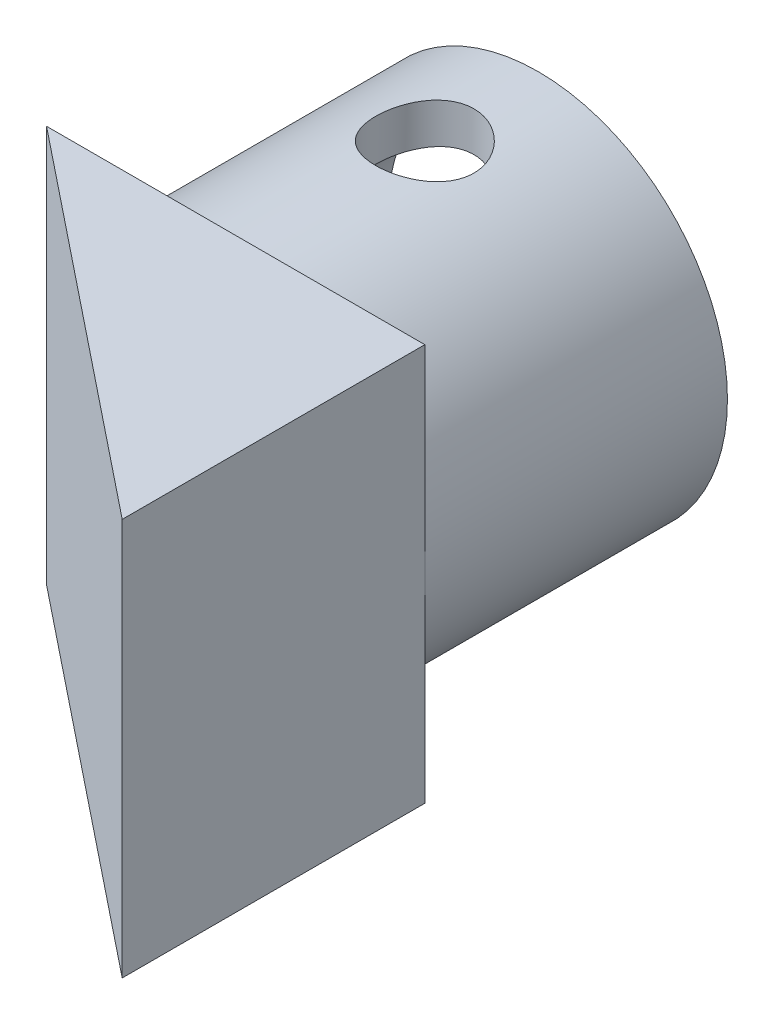
ISO-10303-21;
HEADER;
FILE_DESCRIPTION(('STEP AP214'),'2;1');
FILE_NAME('part.step','',(''),(''),'','','');
FILE_SCHEMA(('AUTOMOTIVE_DESIGN { 1 0 10303 214 1 1 1 1 }'));
ENDSEC;
DATA;
#1=APPLICATION_CONTEXT('core data for automotive mechanical design processes');
#2=APPLICATION_PROTOCOL_DEFINITION('international standard','automotive_design',2000,#1);
#3=PRODUCT_CONTEXT('',#1,'mechanical');
#4=PRODUCT('Part','Part','',(#3));
#5=PRODUCT_RELATED_PRODUCT_CATEGORY('part','',(#4));
#6=PRODUCT_DEFINITION_FORMATION('','',#4);
#7=PRODUCT_DEFINITION_CONTEXT('part definition',#1,'design');
#8=PRODUCT_DEFINITION('design','',#6,#7);
#9=PRODUCT_DEFINITION_SHAPE('','',#8);
#10=(LENGTH_UNIT() NAMED_UNIT(*) SI_UNIT(.MILLI.,.METRE.));
#11=(NAMED_UNIT(*) PLANE_ANGLE_UNIT() SI_UNIT($,.RADIAN.));
#12=(NAMED_UNIT(*) SI_UNIT($,.STERADIAN.) SOLID_ANGLE_UNIT());
#13=UNCERTAINTY_MEASURE_WITH_UNIT(LENGTH_MEASURE(1.E-05),#10,'distance_accuracy_value','');
#14=(GEOMETRIC_REPRESENTATION_CONTEXT(3) GLOBAL_UNCERTAINTY_ASSIGNED_CONTEXT((#13)) GLOBAL_UNIT_ASSIGNED_CONTEXT((#10,
#11,#12)) REPRESENTATION_CONTEXT('',''));
#15=CARTESIAN_POINT('',(0.,0.,0.));
#16=DIRECTION('',(0.,0.,1.));
#17=DIRECTION('',(1.,0.,0.));
#18=AXIS2_PLACEMENT_3D('',#15,#16,#17);
#19=CARTESIAN_POINT('',(0.,0.,0.));
#20=DIRECTION('',(0.,0.,1.));
#21=DIRECTION('',(1.,0.,0.));
#22=AXIS2_PLACEMENT_3D('',#19,#20,#21);
#23=PLANE('',#22);
#24=CARTESIAN_POINT('',(0.,0.,0.));
#25=DIRECTION('',(0.,0.,1.));
#26=DIRECTION('',(1.,0.,0.));
#27=AXIS2_PLACEMENT_3D('',#24,#25,#26);
#28=CIRCLE('',#27,5.);
#29=CARTESIAN_POINT('',(5.,0.,0.));
#30=VERTEX_POINT('',#29);
#31=EDGE_CURVE('E128',#30,#30,#28,.T.);
#32=ORIENTED_EDGE('',*,*,#31,.F.);
#33=EDGE_LOOP('',(#32));
#34=FACE_BOUND('',#33,.T.);
#35=CARTESIAN_POINT('',(0.,0.,0.));
#36=DIRECTION('',(0.,0.,1.));
#37=DIRECTION('',(1.,0.,0.));
#38=AXIS2_PLACEMENT_3D('',#35,#36,#37);
#39=CIRCLE('',#38,3.95);
#40=CARTESIAN_POINT('',(3.95,0.,0.));
#41=VERTEX_POINT('',#40);
#42=EDGE_CURVE('E126',#41,#41,#39,.T.);
#43=ORIENTED_EDGE('',*,*,#42,.T.);
#44=EDGE_LOOP('',(#43));
#45=FACE_BOUND('',#44,.T.);
#46=ADVANCED_FACE('F35',(#34,#45),#23,.F.);
#47=CARTESIAN_POINT('',(0.,0.,8.));
#48=DIRECTION('',(0.,0.,-1.));
#49=DIRECTION('',(-1.,0.,0.));
#50=AXIS2_PLACEMENT_3D('',#47,#48,#49);
#51=CYLINDRICAL_SURFACE('',#50,5.);
#52=CARTESIAN_POINT('',(0.,-5.,4.3));
#53=CARTESIAN_POINT('',(0.0717307786716108,-4.99999885912454,4.29999816586154));
#54=CARTESIAN_POINT('',(0.14348153894728,-4.998441140995,4.29404317706765));
#55=CARTESIAN_POINT('',(0.284920413497907,-4.99237823364744,4.2704200751648));
#56=CARTESIAN_POINT('',(0.354607444099347,-4.98787152361252,4.25274591833176));
#57=CARTESIAN_POINT('',(0.489856453463625,-4.97640871761101,4.20629469406177));
#58=CARTESIAN_POINT('',(0.555423483742325,-4.96945569296409,4.1775315444106));
#59=CARTESIAN_POINT('',(0.680802479922511,-4.95383737776702,4.10976934681149));
#60=CARTESIAN_POINT('',(0.740614138181474,-4.94517199576156,4.07076975210864));
#61=CARTESIAN_POINT('',(0.854108529262041,-4.92685216626646,3.98273009067953));
#62=CARTESIAN_POINT('',(0.907645708599976,-4.91718147538334,3.93350576070611));
#63=CARTESIAN_POINT('',(1.0058054182008,-4.89804673326225,3.82680807084766));
#64=CARTESIAN_POINT('',(1.05042685981889,-4.88858270738436,3.76933370507305));
#65=CARTESIAN_POINT('',(1.13018788316099,-4.87076767855598,3.64661851125556));
#66=CARTESIAN_POINT('',(1.16516190324781,-4.86243722215411,3.58126681773134));
#67=CARTESIAN_POINT('',(1.22356960439174,-4.84807058079245,3.44535959205325));
#68=CARTESIAN_POINT('',(1.24700529718818,-4.84203399593172,3.37480496951268));
#69=CARTESIAN_POINT('',(1.281169228899,-4.83310598130334,3.23210205052739));
#70=CARTESIAN_POINT('',(1.29216048290362,-4.83014956376373,3.16002088452016));
#71=CARTESIAN_POINT('',(1.3019432296733,-4.82752230668979,3.01498176997082));
#72=CARTESIAN_POINT('',(1.30073688084738,-4.82785088586354,2.94202397883275));
#73=CARTESIAN_POINT('',(1.2863678960504,-4.83169822957429,2.79934028716682));
#74=CARTESIAN_POINT('',(1.2735215273875,-4.83513260277125,2.72957990208878));
#75=CARTESIAN_POINT('',(1.23674288104121,-4.84466969943908,2.59324021046968));
#76=CARTESIAN_POINT('',(1.21280975642708,-4.85077262676204,2.52666114738238));
#77=CARTESIAN_POINT('',(1.15427447680391,-4.86503471141451,2.39774002853324));
#78=CARTESIAN_POINT('',(1.11955986166448,-4.87321536914182,2.33545151285766));
#79=CARTESIAN_POINT('',(1.04052555441476,-4.89069936804917,2.21747178012729));
#80=CARTESIAN_POINT('',(0.996204056417375,-4.90000292016326,2.16178180650457));
#81=CARTESIAN_POINT('',(0.897588399354158,-4.9190373655284,2.0567707801978));
#82=CARTESIAN_POINT('',(0.843028117151478,-4.92877257463288,2.00770008928812));
#83=CARTESIAN_POINT('',(0.726334791666221,-4.947314710364,1.91935513083208));
#84=CARTESIAN_POINT('',(0.664201478488647,-4.95612160388557,1.88008121258463));
#85=CARTESIAN_POINT('',(0.533750553018985,-4.97186464472852,1.81234191921762));
#86=CARTESIAN_POINT('',(0.465409427094992,-4.97879324641701,1.78391995820683));
#87=CARTESIAN_POINT('',(0.324698261892371,-4.98994437896931,1.73903950096387));
#88=CARTESIAN_POINT('',(0.25232906151994,-4.99416747102063,1.72257852364206));
#89=CARTESIAN_POINT('',(0.107754265628856,-4.99934762845146,1.70247601810568));
#90=CARTESIAN_POINT('',(0.0355990679618569,-5.00039144909205,1.69849388039378));
#91=CARTESIAN_POINT('',(-0.108347558385988,-4.9993439302767,1.70252407708697));
#92=CARTESIAN_POINT('',(-0.180139021986154,-4.99725289772412,1.71053523734338));
#93=CARTESIAN_POINT('',(-0.320117661841459,-4.9902264842307,1.73804465756627));
#94=CARTESIAN_POINT('',(-0.3883443967086,-4.98533775354441,1.75735463113079));
#95=CARTESIAN_POINT('',(-0.520584855265785,-4.97326895706077,1.80669635149957));
#96=CARTESIAN_POINT('',(-0.584598133561371,-4.966088649494,1.83672922964772));
#97=CARTESIAN_POINT('',(-0.707930992016775,-4.95002802767655,1.90730750951055));
#98=CARTESIAN_POINT('',(-0.767139321552233,-4.94111821378144,1.94804043928579));
#99=CARTESIAN_POINT('',(-0.878000441471827,-4.92262930746647,2.03862522166252));
#100=CARTESIAN_POINT('',(-0.929651812778711,-4.91305008984093,2.08847878302904));
#101=CARTESIAN_POINT('',(-1.02535533145664,-4.89398559724572,2.19747610283433));
#102=CARTESIAN_POINT('',(-1.0691676974822,-4.88450966299983,2.25683240802754));
#103=CARTESIAN_POINT('',(-1.14621298401497,-4.86700757475785,2.38225303325104));
#104=CARTESIAN_POINT('',(-1.1794463607291,-4.85898135825078,2.44831706385618));
#105=CARTESIAN_POINT('',(-1.23414034237999,-4.84537844502717,2.58493610486184));
#106=CARTESIAN_POINT('',(-1.25567007103908,-4.83978740561989,2.65546193804776));
#107=CARTESIAN_POINT('',(-1.28651743722663,-4.83168004742566,2.79930171484937));
#108=CARTESIAN_POINT('',(-1.29583800946139,-4.82916298975776,2.87261498408958));
#109=CARTESIAN_POINT('',(-1.30183988013393,-4.82754813134566,3.01749983369733));
#110=CARTESIAN_POINT('',(-1.29890566929442,-4.82834631145179,3.08905457201614));
#111=CARTESIAN_POINT('',(-1.28136829919157,-4.83302969132189,3.2306112653395));
#112=CARTESIAN_POINT('',(-1.26676541261453,-4.83691481894669,3.30061325659105));
#113=CARTESIAN_POINT('',(-1.22652296626336,-4.84727400349191,3.43662027692297));
#114=CARTESIAN_POINT('',(-1.20096107281371,-4.85372981947422,3.5026497724797));
#115=CARTESIAN_POINT('',(-1.13958690119683,-4.86850424398437,3.62953183040472));
#116=CARTESIAN_POINT('',(-1.10377308914157,-4.87682313122364,3.6903836163174));
#117=CARTESIAN_POINT('',(-1.02173013022611,-4.89467814244603,3.8070274672692));
#118=CARTESIAN_POINT('',(-0.975236798928221,-4.90424188358561,3.86262951434169));
#119=CARTESIAN_POINT('',(-0.87366206477925,-4.92335054739323,3.96536747478793));
#120=CARTESIAN_POINT('',(-0.818578597936101,-4.93289546497886,4.01250134760105));
#121=CARTESIAN_POINT('',(-0.700055598942872,-4.95111947868785,4.09789014611913));
#122=CARTESIAN_POINT('',(-0.636470787048337,-4.9597774014975,4.13594830359197));
#123=CARTESIAN_POINT('',(-0.503584101499031,-4.97502379799897,4.20077479935966));
#124=CARTESIAN_POINT('',(-0.434286110017087,-4.9816136625622,4.22755072968078));
#125=CARTESIAN_POINT('',(-0.304324490623244,-4.99107925028337,4.26536273677146));
#126=CARTESIAN_POINT('',(-0.244245830872915,-4.99440072931575,4.27832240703174));
#127=CARTESIAN_POINT('',(-0.122782916586036,-4.99886149574191,4.29564144249486));
#128=CARTESIAN_POINT('',(-0.0613987782532483,-5.00000097654537,4.30000156995174));
#129=CARTESIAN_POINT('',(0.,-5.,4.3));
#130=B_SPLINE_CURVE_WITH_KNOTS('',3,(#52,#53,#54,#55,#56,#57,#58,#59,#60,#61,#62,#63,#64,#65,
#66,#67,#68,#69,#70,#71,#72,#73,#74,#75,#76,#77,#78,#79,#80,#81,#82,#83,#84,#85,#86,#87,#88,#89,
#90,#91,#92,#93,#94,#95,#96,#97,#98,#99,#100,#101,#102,#103,#104,#105,#106,#107,#108,#109,#110,
#111,#112,#113,#114,#115,#116,#117,#118,#119,#120,#121,#122,#123,#124,#125,#126,#127,#128,#129),
.UNSPECIFIED.,.T.,.F.,(4,2,2,2,2,2,2,2,2,2,2,2,2,2,2,2,2,2,2,2,2,2,2,2,2,2,2,2,2,2,2,2,2,2,2,2,
2,2,4),(0.,0.214967237033415,0.43004542172036,0.64485453617895,0.859675126481417,
1.07876816860036,1.29788794646979,1.52056237814132,1.74319797214783,1.96103475933145,
2.17883300019886,2.39088534386669,2.60295388914234,2.8173133212086,3.03171308323144,
3.25274629224052,3.47378738094936,3.69570372080879,3.91757401498792,4.13333313105578,
4.34907112560078,4.56131245775761,4.77357618952829,4.98984196043499,5.20614829065226,
5.42823125959202,5.65030465015768,5.87105177957784,6.09174583842406,6.30556854774109,
6.51938626036272,6.73171306829717,6.94407166110446,7.16239228611878,7.38076544910422,
7.60351288552391,7.82611019062644,8.01013016140658,8.19413382012542),.UNSPECIFIED.);
#131=CARTESIAN_POINT('',(0.,-5.,4.3));
#132=VERTEX_POINT('',#131);
#133=EDGE_CURVE('E100',#132,#132,#130,.T.);
#134=ORIENTED_EDGE('',*,*,#133,.T.);
#135=EDGE_LOOP('',(#134));
#136=FACE_BOUND('',#135,.T.);
#137=CARTESIAN_POINT('',(0.,5.,4.3));
#138=CARTESIAN_POINT('',(-0.0717307786716102,4.99999885912454,4.29999816586154));
#139=CARTESIAN_POINT('',(-0.14348153894728,4.998441140995,4.29404317706765));
#140=CARTESIAN_POINT('',(-0.284920413497906,4.99237823364744,4.2704200751648));
#141=CARTESIAN_POINT('',(-0.354607444099346,4.98787152361252,4.25274591833176));
#142=CARTESIAN_POINT('',(-0.489856453463625,4.97640871761101,4.20629469406177));
#143=CARTESIAN_POINT('',(-0.555423483742324,4.96945569296409,4.1775315444106));
#144=CARTESIAN_POINT('',(-0.68080247992251,4.95383737776702,4.10976934681149));
#145=CARTESIAN_POINT('',(-0.740614138181473,4.94517199576156,4.07076975210864));
#146=CARTESIAN_POINT('',(-0.854108529262041,4.92685216626646,3.98273009067953));
#147=CARTESIAN_POINT('',(-0.907645708599976,4.91718147538334,3.93350576070611));
#148=CARTESIAN_POINT('',(-1.0058054182008,4.89804673326225,3.82680807084766));
#149=CARTESIAN_POINT('',(-1.05042685981889,4.88858270738436,3.76933370507305));
#150=CARTESIAN_POINT('',(-1.13018788316099,4.87076767855598,3.64661851125556));
#151=CARTESIAN_POINT('',(-1.16516190324781,4.86243722215411,3.58126681773134));
#152=CARTESIAN_POINT('',(-1.22356960439173,4.84807058079245,3.44535959205325));
#153=CARTESIAN_POINT('',(-1.24700529718818,4.84203399593172,3.37480496951268));
#154=CARTESIAN_POINT('',(-1.281169228899,4.83310598130334,3.23210205052739));
#155=CARTESIAN_POINT('',(-1.29216048290362,4.83014956376373,3.16002088452016));
#156=CARTESIAN_POINT('',(-1.3019432296733,4.82752230668979,3.01498176997082));
#157=CARTESIAN_POINT('',(-1.30073688084738,4.82785088586354,2.94202397883275));
#158=CARTESIAN_POINT('',(-1.2863678960504,4.83169822957429,2.79934028716682));
#159=CARTESIAN_POINT('',(-1.2735215273875,4.83513260277125,2.72957990208878));
#160=CARTESIAN_POINT('',(-1.23674288104121,4.84466969943908,2.59324021046968));
#161=CARTESIAN_POINT('',(-1.21280975642707,4.85077262676204,2.52666114738238));
#162=CARTESIAN_POINT('',(-1.15427447680391,4.86503471141451,2.39774002853324));
#163=CARTESIAN_POINT('',(-1.11955986166448,4.87321536914182,2.33545151285766));
#164=CARTESIAN_POINT('',(-1.04052555441476,4.89069936804917,2.21747178012729));
#165=CARTESIAN_POINT('',(-0.996204056417375,4.90000292016326,2.16178180650458));
#166=CARTESIAN_POINT('',(-0.897588399354157,4.9190373655284,2.0567707801978));
#167=CARTESIAN_POINT('',(-0.843028117151478,4.92877257463288,2.00770008928812));
#168=CARTESIAN_POINT('',(-0.726334791666221,4.947314710364,1.91935513083208));
#169=CARTESIAN_POINT('',(-0.664201478488647,4.95612160388557,1.88008121258463));
#170=CARTESIAN_POINT('',(-0.533750553018985,4.97186464472852,1.81234191921762));
#171=CARTESIAN_POINT('',(-0.465409427094992,4.978793246417,1.78391995820683));
#172=CARTESIAN_POINT('',(-0.324698261892371,4.98994437896931,1.73903950096387));
#173=CARTESIAN_POINT('',(-0.25232906151994,4.99416747102063,1.72257852364206));
#174=CARTESIAN_POINT('',(-0.107754265628856,4.99934762845146,1.70247601810568));
#175=CARTESIAN_POINT('',(-0.0355990679618568,5.00039144909205,1.69849388039378));
#176=CARTESIAN_POINT('',(0.108347558385988,4.9993439302767,1.70252407708697));
#177=CARTESIAN_POINT('',(0.180139021986154,4.99725289772412,1.71053523734338));
#178=CARTESIAN_POINT('',(0.320117661841459,4.9902264842307,1.73804465756627));
#179=CARTESIAN_POINT('',(0.3883443967086,4.98533775354441,1.75735463113079));
#180=CARTESIAN_POINT('',(0.520584855265785,4.97326895706077,1.80669635149957));
#181=CARTESIAN_POINT('',(0.584598133561372,4.966088649494,1.83672922964772));
#182=CARTESIAN_POINT('',(0.707930992016775,4.95002802767655,1.90730750951055));
#183=CARTESIAN_POINT('',(0.767139321552233,4.94111821378144,1.94804043928579));
#184=CARTESIAN_POINT('',(0.878000441471828,4.92262930746647,2.03862522166252));
#185=CARTESIAN_POINT('',(0.929651812778711,4.91305008984093,2.08847878302904));
#186=CARTESIAN_POINT('',(1.02535533145664,4.89398559724572,2.19747610283433));
#187=CARTESIAN_POINT('',(1.0691676974822,4.88450966299983,2.25683240802754));
#188=CARTESIAN_POINT('',(1.14621298401497,4.86700757475785,2.38225303325104));
#189=CARTESIAN_POINT('',(1.1794463607291,4.85898135825078,2.44831706385618));
#190=CARTESIAN_POINT('',(1.23414034237999,4.84537844502717,2.58493610486184));
#191=CARTESIAN_POINT('',(1.25567007103908,4.83978740561989,2.65546193804776));
#192=CARTESIAN_POINT('',(1.28651743722663,4.83168004742566,2.79930171484937));
#193=CARTESIAN_POINT('',(1.29583800946139,4.82916298975776,2.87261498408958));
#194=CARTESIAN_POINT('',(1.30183988013393,4.82754813134566,3.01749983369733));
#195=CARTESIAN_POINT('',(1.29890566929442,4.82834631145179,3.08905457201614));
#196=CARTESIAN_POINT('',(1.28136829919157,4.83302969132189,3.2306112653395));
#197=CARTESIAN_POINT('',(1.26676541261453,4.83691481894669,3.30061325659104));
#198=CARTESIAN_POINT('',(1.22652296626336,4.84727400349191,3.43662027692297));
#199=CARTESIAN_POINT('',(1.20096107281371,4.85372981947422,3.5026497724797));
#200=CARTESIAN_POINT('',(1.13958690119683,4.86850424398437,3.62953183040472));
#201=CARTESIAN_POINT('',(1.10377308914157,4.87682313122364,3.6903836163174));
#202=CARTESIAN_POINT('',(1.02173013022611,4.89467814244602,3.8070274672692));
#203=CARTESIAN_POINT('',(0.975236798928222,4.90424188358561,3.86262951434169));
#204=CARTESIAN_POINT('',(0.873662064779251,4.92335054739323,3.96536747478793));
#205=CARTESIAN_POINT('',(0.818578597936103,4.93289546497886,4.01250134760105));
#206=CARTESIAN_POINT('',(0.700055598942874,4.95111947868785,4.09789014611913));
#207=CARTESIAN_POINT('',(0.636470787048339,4.9597774014975,4.13594830359197));
#208=CARTESIAN_POINT('',(0.503584101499032,4.97502379799897,4.20077479935966));
#209=CARTESIAN_POINT('',(0.434286110017088,4.9816136625622,4.22755072968078));
#210=CARTESIAN_POINT('',(0.304324490623245,4.99107925028337,4.26536273677146));
#211=CARTESIAN_POINT('',(0.244245830872916,4.99440072931575,4.27832240703174));
#212=CARTESIAN_POINT('',(0.122782916586037,4.99886149574191,4.29564144249486));
#213=CARTESIAN_POINT('',(0.061398778253249,5.00000097654536,4.30000156995174));
#214=CARTESIAN_POINT('',(0.,5.,4.3));
#215=B_SPLINE_CURVE_WITH_KNOTS('',3,(#137,#138,#139,#140,#141,#142,#143,#144,#145,#146,#147,
#148,#149,#150,#151,#152,#153,#154,#155,#156,#157,#158,#159,#160,#161,#162,#163,#164,#165,#166,
#167,#168,#169,#170,#171,#172,#173,#174,#175,#176,#177,#178,#179,#180,#181,#182,#183,#184,#185,
#186,#187,#188,#189,#190,#191,#192,#193,#194,#195,#196,#197,#198,#199,#200,#201,#202,#203,#204,
#205,#206,#207,#208,#209,#210,#211,#212,#213,#214),.UNSPECIFIED.,.T.,.F.,(4,2,2,2,2,2,2,2,2,2,2,
2,2,2,2,2,2,2,2,2,2,2,2,2,2,2,2,2,2,2,2,2,2,2,2,2,2,2,4),(0.,0.214967237033415,0.43004542172036,
0.64485453617895,0.859675126481417,1.07876816860036,1.29788794646979,1.52056237814133,
1.74319797214784,1.96103475933145,2.17883300019886,2.39088534386669,2.60295388914234,
2.8173133212086,3.03171308323144,3.25274629224052,3.47378738094936,3.69570372080879,
3.91757401498792,4.13333313105578,4.34907112560077,4.56131245775761,4.77357618952829,
4.98984196043498,5.20614829065226,5.42823125959202,5.65030465015768,5.87105177957784,
6.09174583842406,6.30556854774109,6.51938626036272,6.73171306829716,6.94407166110446,
7.16239228611877,7.38076544910421,7.60351288552391,7.82611019062644,8.01013016140658,
8.19413382012542),.UNSPECIFIED.);
#216=CARTESIAN_POINT('',(0.,5.,4.3));
#217=VERTEX_POINT('',#216);
#218=EDGE_CURVE('E103',#217,#217,#215,.T.);
#219=ORIENTED_EDGE('',*,*,#218,.T.);
#220=EDGE_LOOP('',(#219));
#221=FACE_BOUND('',#220,.T.);
#222=CARTESIAN_POINT('',(0.,0.,8.));
#223=DIRECTION('',(0.,0.,1.));
#224=DIRECTION('',(1.,0.,0.));
#225=AXIS2_PLACEMENT_3D('',#222,#223,#224);
#226=CIRCLE('',#225,5.);
#227=CARTESIAN_POINT('',(5.,0.,8.));
#228=VERTEX_POINT('',#227);
#229=CARTESIAN_POINT('',(-5.,0.,8.));
#230=VERTEX_POINT('',#229);
#231=EDGE_CURVE('E11',#228,#230,#226,.T.);
#232=ORIENTED_EDGE('',*,*,#231,.F.);
#233=EDGE_CURVE('E50',#230,#228,#226,.T.);
#234=ORIENTED_EDGE('',*,*,#233,.F.);
#235=EDGE_LOOP('',(#232,#234));
#236=FACE_BOUND('',#235,.T.);
#237=ORIENTED_EDGE('',*,*,#31,.T.);
#238=EDGE_LOOP('',(#237));
#239=FACE_BOUND('',#238,.T.);
#240=ADVANCED_FACE('F37',(#136,#221,#236,#239),#51,.T.);
#241=CARTESIAN_POINT('',(0.,0.,8.));
#242=DIRECTION('',(0.,0.,-1.));
#243=DIRECTION('',(-1.,0.,0.));
#244=AXIS2_PLACEMENT_3D('',#241,#242,#243);
#245=CYLINDRICAL_SURFACE('',#244,3.95);
#246=CARTESIAN_POINT('',(0.,-3.95,4.3));
#247=CARTESIAN_POINT('',(0.0709829610794788,-3.95000007319669,4.30000015496706));
#248=CARTESIAN_POINT('',(0.14196536135004,-3.94806888480818,4.29416728741721));
#249=CARTESIAN_POINT('',(0.281842460307813,-3.94055500859883,4.27105919979852));
#250=CARTESIAN_POINT('',(0.350736888829278,-3.93497185033702,4.2537825055504));
#251=CARTESIAN_POINT('',(0.484401191575012,-3.92076136710928,4.20844096000981));
#252=CARTESIAN_POINT('',(0.549177652461634,-3.9121390556356,4.18039386915953));
#253=CARTESIAN_POINT('',(0.673107429858449,-3.89273244747134,4.11438698716866));
#254=CARTESIAN_POINT('',(0.732259678531228,-3.88194774142271,4.0764253187093));
#255=CARTESIAN_POINT('',(0.845265075149385,-3.85894489751455,3.99031612890366));
#256=CARTESIAN_POINT('',(0.89890136997805,-3.84669305468934,3.94189307254206));
#257=CARTESIAN_POINT('',(0.997456700192528,-3.82232422733423,3.83682165173222));
#258=CARTESIAN_POINT('',(1.04237387990989,-3.81020727202824,3.78017154081459));
#259=CARTESIAN_POINT('',(1.1234408644698,-3.78711121004201,3.65831739712311));
#260=CARTESIAN_POINT('',(1.15931106042597,-3.77617328695265,3.59291879013108));
#261=CARTESIAN_POINT('',(1.21945167342663,-3.75718505179296,3.45659912705684));
#262=CARTESIAN_POINT('',(1.24372552881538,-3.74913388396926,3.38567971516913));
#263=CARTESIAN_POINT('',(1.27917503844399,-3.73718516362997,3.24279371838596));
#264=CARTESIAN_POINT('',(1.29075620504918,-3.73315940217963,3.17093877498848));
#265=CARTESIAN_POINT('',(1.30175911632934,-3.72933778753418,3.02620155686063));
#266=CARTESIAN_POINT('',(1.30118450700256,-3.72954066600234,2.95331959672737));
#267=CARTESIAN_POINT('',(1.2882075087873,-3.73404088461962,2.81203373626257));
#268=CARTESIAN_POINT('',(1.2763314294693,-3.7381560226238,2.74357469058409));
#269=CARTESIAN_POINT('',(1.24194610977985,-3.7497193934349,2.60968097377534));
#270=CARTESIAN_POINT('',(1.21943562623389,-3.75716801592475,2.54424665722159));
#271=CARTESIAN_POINT('',(1.16407040176717,-3.77469092256335,2.4170521138585));
#272=CARTESIAN_POINT('',(1.13105780106689,-3.78480484262511,2.35536629655166));
#273=CARTESIAN_POINT('',(1.05573504075254,-3.80650183445498,2.23824219729294));
#274=CARTESIAN_POINT('',(1.0134222502111,-3.81808532155556,2.18280568993326));
#275=CARTESIAN_POINT('',(0.918161106732507,-3.84213602985152,2.07679261318661));
#276=CARTESIAN_POINT('',(0.864781593451721,-3.85461824878812,2.02660610268542));
#277=CARTESIAN_POINT('',(0.750209988414886,-3.87854424723023,1.93579673630937));
#278=CARTESIAN_POINT('',(0.689017185410521,-3.88998793203492,1.89517475205752));
#279=CARTESIAN_POINT('',(0.559744462015838,-3.91069118030887,1.82434398654903));
#280=CARTESIAN_POINT('',(0.49160487665367,-3.91992906245069,1.79423732821378));
#281=CARTESIAN_POINT('',(0.350851932060614,-3.9350226581483,1.74603371751428));
#282=CARTESIAN_POINT('',(0.278240095231164,-3.94087951567502,1.72793270272698));
#283=CARTESIAN_POINT('',(0.133907777181065,-3.94836276643493,1.70493970975314));
#284=CARTESIAN_POINT('',(0.0622799280435584,-3.95015792191676,1.69952046048883));
#285=CARTESIAN_POINT('',(-0.080874434703633,-3.94982019483739,1.70054603172145));
#286=CARTESIAN_POINT('',(-0.152400963007653,-3.94768795651755,1.7069889063806));
#287=CARTESIAN_POINT('',(-0.291227855065199,-3.93984632587967,1.73113729714739));
#288=CARTESIAN_POINT('',(-0.358590496320938,-3.93423914132638,1.74852122648915));
#289=CARTESIAN_POINT('',(-0.489417776330051,-3.92011519057551,1.79365820032025));
#290=CARTESIAN_POINT('',(-0.552881919398139,-3.91159805528393,1.82141256022208));
#291=CARTESIAN_POINT('',(-0.675944292882697,-3.89224643648506,1.88730191155046));
#292=CARTESIAN_POINT('',(-0.735399599198763,-3.88135758816091,1.92568742409159));
#293=CARTESIAN_POINT('',(-0.847197627537397,-3.85849938864648,2.01145387506343));
#294=CARTESIAN_POINT('',(-0.899538218222748,-3.84652971545561,2.05883749889035));
#295=CARTESIAN_POINT('',(-0.998029128419559,-3.82218877391626,2.16373522222728));
#296=CARTESIAN_POINT('',(-1.04380324807566,-3.80982315984666,2.22160470226723));
#297=CARTESIAN_POINT('',(-1.12503463563222,-3.78663273975186,2.34446983447141));
#298=CARTESIAN_POINT('',(-1.16049187612873,-3.77580793781943,2.40946550556379));
#299=CARTESIAN_POINT('',(-1.21990529933038,-3.75703410640062,2.54472890444885));
#300=CARTESIAN_POINT('',(-1.24388973000913,-3.74907802567282,2.61498318573575));
#301=CARTESIAN_POINT('',(-1.27958419134187,-3.73704776555513,2.7588543970303));
#302=CARTESIAN_POINT('',(-1.29129956872311,-3.73297189527993,2.83246984766635));
#303=CARTESIAN_POINT('',(-1.3017129830352,-3.72935255258117,2.97700571424406));
#304=CARTESIAN_POINT('',(-1.30103388967695,-3.72959220035743,3.04787633373853));
#305=CARTESIAN_POINT('',(-1.28820451606761,-3.73404260303012,3.18843802953583));
#306=CARTESIAN_POINT('',(-1.27605488625723,-3.73825313275631,3.25812917249318));
#307=CARTESIAN_POINT('',(-1.24106544064758,-3.75001139104323,3.3931056292899));
#308=CARTESIAN_POINT('',(-1.21842244972763,-3.7574975400071,3.45844774727636));
#309=CARTESIAN_POINT('',(-1.16324748256122,-3.77494219323695,3.58445605209423));
#310=CARTESIAN_POINT('',(-1.13071334686503,-3.78490123730203,3.64512121421631));
#311=CARTESIAN_POINT('',(-1.05505697496557,-3.80670007161102,3.76286197608261));
#312=CARTESIAN_POINT('',(-1.01154177410332,-3.81860203416956,3.81967349820157));
#313=CARTESIAN_POINT('',(-0.915828422105698,-3.84268011210813,3.92538928804488));
#314=CARTESIAN_POINT('',(-0.863627844240041,-3.85485630328434,3.97429133827809));
#315=CARTESIAN_POINT('',(-0.749665815985926,-3.87866086303045,4.06465216852757));
#316=CARTESIAN_POINT('',(-0.687618514208386,-3.89025137725221,4.10576162665907));
#317=CARTESIAN_POINT('',(-0.55711633930698,-3.91107127668562,4.1769199425958));
#318=CARTESIAN_POINT('',(-0.488663298715251,-3.92030133436528,4.20697195161911));
#319=CARTESIAN_POINT('',(-0.351026862609448,-3.93494752746252,4.25370601462609));
#320=CARTESIAN_POINT('',(-0.282074158010249,-3.94053976608284,4.27101187422552));
#321=CARTESIAN_POINT('',(-0.142080417052831,-3.94806549083472,4.29415730108766));
#322=CARTESIAN_POINT('',(-0.071039927671705,-3.94999992674457,4.29999984490858));
#323=CARTESIAN_POINT('',(0.,-3.95,4.3));
#324=B_SPLINE_CURVE_WITH_KNOTS('',3,(#246,#247,#248,#249,#250,#251,#252,#253,#254,#255,#256,
#257,#258,#259,#260,#261,#262,#263,#264,#265,#266,#267,#268,#269,#270,#271,#272,#273,#274,#275,
#276,#277,#278,#279,#280,#281,#282,#283,#284,#285,#286,#287,#288,#289,#290,#291,#292,#293,#294,
#295,#296,#297,#298,#299,#300,#301,#302,#303,#304,#305,#306,#307,#308,#309,#310,#311,#312,#313,
#314,#315,#316,#317,#318,#319,#320,#321,#322,#323),.UNSPECIFIED.,.T.,.F.,(4,2,2,2,2,2,2,2,2,2,2,
2,2,2,2,2,2,2,2,2,2,2,2,2,2,2,2,2,2,2,2,2,2,2,2,2,2,2,4),(0.,0.21268752357525,0.425402450617592,
0.637768105486071,0.850174000841619,1.06906314379544,1.28799882144892,1.51304348702423,
1.73802138481084,1.95558076606883,2.17307489358419,2.3809118534688,2.58877311575606,
2.79991944977384,3.01112559195614,3.23306326797123,3.45502116152521,3.67907835383957,
3.90305969181944,4.11754903269423,4.33200319232519,4.54043083618269,4.74888492652624,
4.9627445204427,5.1766680392046,5.40005360546788,5.62343976508835,5.84627304291175,
6.06900917182374,6.28058421457521,6.49214726061179,6.69989333042927,6.90768478829359,
7.12435351639361,7.34108288460678,7.56596749637109,7.79078796944134,8.0037014753647,
8.21655968896532),.UNSPECIFIED.);
#325=CARTESIAN_POINT('',(0.,-3.95,4.3));
#326=VERTEX_POINT('',#325);
#327=EDGE_CURVE('E40',#326,#326,#324,.T.);
#328=ORIENTED_EDGE('',*,*,#327,.F.);
#329=EDGE_LOOP('',(#328));
#330=FACE_BOUND('',#329,.T.);
#331=CARTESIAN_POINT('',(0.,3.95,4.3));
#332=CARTESIAN_POINT('',(-0.0709829610794781,3.95000007319669,4.30000015496706));
#333=CARTESIAN_POINT('',(-0.141965361350039,3.94806888480818,4.29416728741721));
#334=CARTESIAN_POINT('',(-0.281842460307813,3.94055500859883,4.27105919979852));
#335=CARTESIAN_POINT('',(-0.350736888829277,3.93497185033702,4.2537825055504));
#336=CARTESIAN_POINT('',(-0.484401191575012,3.92076136710928,4.20844096000981));
#337=CARTESIAN_POINT('',(-0.549177652461634,3.9121390556356,4.18039386915953));
#338=CARTESIAN_POINT('',(-0.673107429858449,3.89273244747134,4.11438698716866));
#339=CARTESIAN_POINT('',(-0.732259678531228,3.88194774142271,4.0764253187093));
#340=CARTESIAN_POINT('',(-0.845265075149385,3.85894489751455,3.99031612890366));
#341=CARTESIAN_POINT('',(-0.898901369978049,3.84669305468934,3.94189307254206));
#342=CARTESIAN_POINT('',(-0.997456700192528,3.82232422733423,3.83682165173222));
#343=CARTESIAN_POINT('',(-1.04237387990989,3.81020727202824,3.78017154081459));
#344=CARTESIAN_POINT('',(-1.1234408644698,3.78711121004201,3.65831739712311));
#345=CARTESIAN_POINT('',(-1.15931106042597,3.77617328695265,3.59291879013108));
#346=CARTESIAN_POINT('',(-1.21945167342663,3.75718505179296,3.45659912705684));
#347=CARTESIAN_POINT('',(-1.24372552881538,3.74913388396926,3.38567971516913));
#348=CARTESIAN_POINT('',(-1.27917503844399,3.73718516362997,3.24279371838596));
#349=CARTESIAN_POINT('',(-1.29075620504918,3.73315940217963,3.17093877498848));
#350=CARTESIAN_POINT('',(-1.30175911632934,3.72933778753418,3.02620155686063));
#351=CARTESIAN_POINT('',(-1.30118450700256,3.72954066600234,2.95331959672737));
#352=CARTESIAN_POINT('',(-1.2882075087873,3.73404088461962,2.81203373626257));
#353=CARTESIAN_POINT('',(-1.27633142946929,3.7381560226238,2.74357469058409));
#354=CARTESIAN_POINT('',(-1.24194610977985,3.7497193934349,2.60968097377534));
#355=CARTESIAN_POINT('',(-1.21943562623388,3.75716801592475,2.54424665722159));
#356=CARTESIAN_POINT('',(-1.16407040176717,3.77469092256335,2.4170521138585));
#357=CARTESIAN_POINT('',(-1.13105780106689,3.78480484262511,2.35536629655166));
#358=CARTESIAN_POINT('',(-1.05573504075254,3.80650183445498,2.23824219729294));
#359=CARTESIAN_POINT('',(-1.0134222502111,3.81808532155556,2.18280568993326));
#360=CARTESIAN_POINT('',(-0.918161106732506,3.84213602985152,2.07679261318661));
#361=CARTESIAN_POINT('',(-0.86478159345172,3.85461824878812,2.02660610268542));
#362=CARTESIAN_POINT('',(-0.750209988414886,3.87854424723023,1.93579673630937));
#363=CARTESIAN_POINT('',(-0.689017185410521,3.88998793203492,1.89517475205752));
#364=CARTESIAN_POINT('',(-0.559744462015838,3.91069118030886,1.82434398654903));
#365=CARTESIAN_POINT('',(-0.49160487665367,3.91992906245069,1.79423732821378));
#366=CARTESIAN_POINT('',(-0.350851932060613,3.9350226581483,1.74603371751428));
#367=CARTESIAN_POINT('',(-0.278240095231164,3.94087951567502,1.72793270272698));
#368=CARTESIAN_POINT('',(-0.133907777181065,3.94836276643493,1.70493970975314));
#369=CARTESIAN_POINT('',(-0.0622799280435581,3.95015792191676,1.69952046048883));
#370=CARTESIAN_POINT('',(0.0808744347036335,3.94982019483739,1.70054603172145));
#371=CARTESIAN_POINT('',(0.152400963007654,3.94768795651755,1.7069889063806));
#372=CARTESIAN_POINT('',(0.2912278550652,3.93984632587967,1.73113729714739));
#373=CARTESIAN_POINT('',(0.358590496320939,3.93423914132638,1.74852122648915));
#374=CARTESIAN_POINT('',(0.489417776330053,3.92011519057551,1.79365820032025));
#375=CARTESIAN_POINT('',(0.55288191939814,3.91159805528393,1.82141256022208));
#376=CARTESIAN_POINT('',(0.675944292882698,3.89224643648506,1.88730191155046));
#377=CARTESIAN_POINT('',(0.735399599198764,3.88135758816091,1.92568742409159));
#378=CARTESIAN_POINT('',(0.847197627537398,3.85849938864648,2.01145387506343));
#379=CARTESIAN_POINT('',(0.89953821822275,3.84652971545561,2.05883749889035));
#380=CARTESIAN_POINT('',(0.99802912841956,3.82218877391626,2.16373522222728));
#381=CARTESIAN_POINT('',(1.04380324807566,3.80982315984666,2.22160470226723));
#382=CARTESIAN_POINT('',(1.12503463563223,3.78663273975186,2.34446983447141));
#383=CARTESIAN_POINT('',(1.16049187612873,3.77580793781943,2.40946550556379));
#384=CARTESIAN_POINT('',(1.21990529933038,3.75703410640062,2.54472890444885));
#385=CARTESIAN_POINT('',(1.24388973000913,3.74907802567282,2.61498318573575));
#386=CARTESIAN_POINT('',(1.27958419134187,3.73704776555513,2.7588543970303));
#387=CARTESIAN_POINT('',(1.29129956872311,3.73297189527992,2.83246984766636));
#388=CARTESIAN_POINT('',(1.3017129830352,3.72935255258117,2.97700571424406));
#389=CARTESIAN_POINT('',(1.30103388967695,3.72959220035743,3.04787633373853));
#390=CARTESIAN_POINT('',(1.28820451606761,3.73404260303012,3.18843802953583));
#391=CARTESIAN_POINT('',(1.27605488625723,3.73825313275631,3.25812917249318));
#392=CARTESIAN_POINT('',(1.24106544064758,3.75001139104323,3.3931056292899));
#393=CARTESIAN_POINT('',(1.21842244972763,3.7574975400071,3.45844774727636));
#394=CARTESIAN_POINT('',(1.16324748256122,3.77494219323695,3.58445605209423));
#395=CARTESIAN_POINT('',(1.13071334686504,3.78490123730203,3.64512121421631));
#396=CARTESIAN_POINT('',(1.05505697496557,3.80670007161102,3.76286197608261));
#397=CARTESIAN_POINT('',(1.01154177410332,3.81860203416956,3.81967349820157));
#398=CARTESIAN_POINT('',(0.915828422105699,3.84268011210813,3.92538928804488));
#399=CARTESIAN_POINT('',(0.863627844240042,3.85485630328434,3.97429133827809));
#400=CARTESIAN_POINT('',(0.749665815985927,3.87866086303045,4.06465216852757));
#401=CARTESIAN_POINT('',(0.687618514208387,3.89025137725221,4.10576162665907));
#402=CARTESIAN_POINT('',(0.557116339306981,3.91107127668562,4.1769199425958));
#403=CARTESIAN_POINT('',(0.488663298715252,3.92030133436528,4.20697195161911));
#404=CARTESIAN_POINT('',(0.351026862609449,3.93494752746253,4.25370601462609));
#405=CARTESIAN_POINT('',(0.28207415801025,3.94053976608284,4.27101187422552));
#406=CARTESIAN_POINT('',(0.142080417052832,3.94806549083472,4.29415730108766));
#407=CARTESIAN_POINT('',(0.0710399276717059,3.94999992674457,4.29999984490858));
#408=CARTESIAN_POINT('',(0.,3.95,4.3));
#409=B_SPLINE_CURVE_WITH_KNOTS('',3,(#331,#332,#333,#334,#335,#336,#337,#338,#339,#340,#341,
#342,#343,#344,#345,#346,#347,#348,#349,#350,#351,#352,#353,#354,#355,#356,#357,#358,#359,#360,
#361,#362,#363,#364,#365,#366,#367,#368,#369,#370,#371,#372,#373,#374,#375,#376,#377,#378,#379,
#380,#381,#382,#383,#384,#385,#386,#387,#388,#389,#390,#391,#392,#393,#394,#395,#396,#397,#398,
#399,#400,#401,#402,#403,#404,#405,#406,#407,#408),.UNSPECIFIED.,.T.,.F.,(4,2,2,2,2,2,2,2,2,2,2,
2,2,2,2,2,2,2,2,2,2,2,2,2,2,2,2,2,2,2,2,2,2,2,2,2,2,2,4),(0.,0.21268752357525,0.425402450617592,
0.637768105486071,0.85017400084162,1.06906314379544,1.28799882144892,1.51304348702423,
1.73802138481084,1.95558076606883,2.17307489358419,2.3809118534688,2.58877311575607,
2.79991944977384,3.01112559195614,3.23306326797123,3.4550211615252,3.67907835383957,
3.90305969181944,4.11754903269423,4.33200319232519,4.54043083618269,4.74888492652624,
4.9627445204427,5.1766680392046,5.40005360546788,5.62343976508836,5.84627304291175,
6.06900917182375,6.28058421457521,6.49214726061179,6.69989333042927,6.90768478829358,
7.12435351639361,7.34108288460678,7.56596749637109,7.79078796944134,8.0037014753647,
8.21655968896532),.UNSPECIFIED.);
#410=CARTESIAN_POINT('',(0.,3.95,4.3));
#411=VERTEX_POINT('',#410);
#412=EDGE_CURVE('E131',#411,#411,#409,.T.);
#413=ORIENTED_EDGE('',*,*,#412,.F.);
#414=EDGE_LOOP('',(#413));
#415=FACE_BOUND('',#414,.T.);
#416=CARTESIAN_POINT('',(0.,0.,8.));
#417=DIRECTION('',(0.,0.,1.));
#418=DIRECTION('',(1.,0.,0.));
#419=AXIS2_PLACEMENT_3D('',#416,#417,#418);
#420=CIRCLE('',#419,3.95);
#421=CARTESIAN_POINT('',(3.95,0.,8.));
#422=VERTEX_POINT('',#421);
#423=EDGE_CURVE('E121',#422,#422,#420,.T.);
#424=ORIENTED_EDGE('',*,*,#423,.T.);
#425=EDGE_LOOP('',(#424));
#426=FACE_BOUND('',#425,.T.);
#427=ORIENTED_EDGE('',*,*,#42,.F.);
#428=EDGE_LOOP('',(#427));
#429=FACE_BOUND('',#428,.T.);
#430=ADVANCED_FACE('F136',(#330,#415,#426,#429),#245,.F.);
#431=CARTESIAN_POINT('',(-5.,-5.25,8.));
#432=DIRECTION('',(0.,0.,-1.));
#433=DIRECTION('',(-1.,0.,0.));
#434=AXIS2_PLACEMENT_3D('',#431,#432,#433);
#435=PLANE('',#434);
#436=ORIENTED_EDGE('',*,*,#423,.F.);
#437=EDGE_LOOP('',(#436));
#438=FACE_BOUND('',#437,.T.);
#439=ADVANCED_FACE('F161',(#438),#435,.T.);
#440=DIRECTION('',(0.,1.,0.));
#441=VECTOR('',#440,1.);
#442=CARTESIAN_POINT('',(5.,-5.25,8.));
#443=LINE('',#442,#441);
#444=CARTESIAN_POINT('',(5.,5.25,8.));
#445=VERTEX_POINT('',#444);
#446=EDGE_CURVE('E122',#228,#445,#443,.T.);
#447=ORIENTED_EDGE('',*,*,#446,.F.);
#448=ORIENTED_EDGE('',*,*,#231,.T.);
#449=DIRECTION('',(0.,1.,0.));
#450=VECTOR('',#449,1.);
#451=CARTESIAN_POINT('',(-5.,-5.25,8.));
#452=LINE('',#451,#450);
#453=CARTESIAN_POINT('',(-5.,5.25,8.));
#454=VERTEX_POINT('',#453);
#455=EDGE_CURVE('E78',#230,#454,#452,.T.);
#456=ORIENTED_EDGE('',*,*,#455,.T.);
#457=DIRECTION('',(-1.,0.,0.));
#458=VECTOR('',#457,1.);
#459=CARTESIAN_POINT('',(-5.,5.25,8.));
#460=LINE('',#459,#458);
#461=EDGE_CURVE('E83',#445,#454,#460,.T.);
#462=ORIENTED_EDGE('',*,*,#461,.F.);
#463=EDGE_LOOP('',(#447,#448,#456,#462));
#464=FACE_BOUND('',#463,.T.);
#465=ADVANCED_FACE('F81',(#464),#435,.T.);
#466=CARTESIAN_POINT('',(-5.,-5.25,8.));
#467=VERTEX_POINT('',#466);
#468=EDGE_CURVE('E86',#467,#230,#452,.T.);
#469=ORIENTED_EDGE('',*,*,#468,.T.);
#470=ORIENTED_EDGE('',*,*,#233,.T.);
#471=CARTESIAN_POINT('',(5.,-5.25,8.));
#472=VERTEX_POINT('',#471);
#473=EDGE_CURVE('E118',#472,#228,#443,.T.);
#474=ORIENTED_EDGE('',*,*,#473,.F.);
#475=DIRECTION('',(-1.,0.,0.));
#476=VECTOR('',#475,1.);
#477=CARTESIAN_POINT('',(-5.,-5.25,8.));
#478=LINE('',#477,#476);
#479=EDGE_CURVE('E111',#472,#467,#478,.T.);
#480=ORIENTED_EDGE('',*,*,#479,.T.);
#481=EDGE_LOOP('',(#469,#470,#474,#480));
#482=FACE_BOUND('',#481,.T.);
#483=ADVANCED_FACE('F192',(#482),#435,.T.);
#484=CARTESIAN_POINT('',(5.,-5.25,8.));
#485=DIRECTION('',(1.,0.,0.));
#486=DIRECTION('',(0.,0.,-1.));
#487=AXIS2_PLACEMENT_3D('',#484,#485,#486);
#488=PLANE('',#487);
#489=ORIENTED_EDGE('',*,*,#473,.T.);
#490=ORIENTED_EDGE('',*,*,#446,.T.);
#491=DIRECTION('',(0.,0.,-1.));
#492=VECTOR('',#491,1.);
#493=CARTESIAN_POINT('',(5.,5.25,8.));
#494=LINE('',#493,#492);
#495=CARTESIAN_POINT('',(5.,5.25,16.));
#496=VERTEX_POINT('',#495);
#497=EDGE_CURVE('E97',#496,#445,#494,.T.);
#498=ORIENTED_EDGE('',*,*,#497,.F.);
#499=DIRECTION('',(0.,1.,0.));
#500=VECTOR('',#499,1.);
#501=CARTESIAN_POINT('',(5.,-5.25,16.));
#502=LINE('',#501,#500);
#503=CARTESIAN_POINT('',(5.,-5.25,16.));
#504=VERTEX_POINT('',#503);
#505=EDGE_CURVE('E93',#504,#496,#502,.T.);
#506=ORIENTED_EDGE('',*,*,#505,.F.);
#507=DIRECTION('',(0.,0.,-1.));
#508=VECTOR('',#507,1.);
#509=CARTESIAN_POINT('',(5.,-5.25,8.));
#510=LINE('',#509,#508);
#511=EDGE_CURVE('E87',#504,#472,#510,.T.);
#512=ORIENTED_EDGE('',*,*,#511,.T.);
#513=EDGE_LOOP('',(#489,#490,#498,#506,#512));
#514=FACE_BOUND('',#513,.T.);
#515=ADVANCED_FACE('F203',(#514),#488,.T.);
#516=CARTESIAN_POINT('',(5.,-5.25,16.));
#517=DIRECTION('',(-0.624695047554424,0.,0.78086880944303));
#518=DIRECTION('',(0.78086880944303,0.,0.624695047554424));
#519=AXIS2_PLACEMENT_3D('',#516,#517,#518);
#520=PLANE('',#519);
#521=ORIENTED_EDGE('',*,*,#505,.T.);
#522=DIRECTION('',(0.78086880944303,0.,0.624695047554424));
#523=VECTOR('',#522,1.);
#524=CARTESIAN_POINT('',(5.,5.25,16.));
#525=LINE('',#524,#523);
#526=EDGE_CURVE('E90',#454,#496,#525,.T.);
#527=ORIENTED_EDGE('',*,*,#526,.F.);
#528=ORIENTED_EDGE('',*,*,#455,.F.);
#529=ORIENTED_EDGE('',*,*,#468,.F.);
#530=DIRECTION('',(0.78086880944303,0.,0.624695047554424));
#531=VECTOR('',#530,1.);
#532=CARTESIAN_POINT('',(5.,-5.25,16.));
#533=LINE('',#532,#531);
#534=EDGE_CURVE('E114',#467,#504,#533,.T.);
#535=ORIENTED_EDGE('',*,*,#534,.T.);
#536=EDGE_LOOP('',(#521,#527,#528,#529,#535));
#537=FACE_BOUND('',#536,.T.);
#538=ADVANCED_FACE('F91',(#537),#520,.T.);
#539=CARTESIAN_POINT('',(0.,-5.25,0.));
#540=DIRECTION('',(0.,-1.,0.));
#541=DIRECTION('',(0.,0.,-1.));
#542=AXIS2_PLACEMENT_3D('',#539,#540,#541);
#543=PLANE('',#542);
#544=ORIENTED_EDGE('',*,*,#479,.F.);
#545=ORIENTED_EDGE('',*,*,#511,.F.);
#546=ORIENTED_EDGE('',*,*,#534,.F.);
#547=EDGE_LOOP('',(#544,#545,#546));
#548=FACE_BOUND('',#547,.T.);
#549=ADVANCED_FACE('F217',(#548),#543,.T.);
#550=CARTESIAN_POINT('',(0.,5.25,0.));
#551=DIRECTION('',(0.,-1.,0.));
#552=DIRECTION('',(0.,0.,-1.));
#553=AXIS2_PLACEMENT_3D('',#550,#551,#552);
#554=PLANE('',#553);
#555=ORIENTED_EDGE('',*,*,#461,.T.);
#556=ORIENTED_EDGE('',*,*,#526,.T.);
#557=ORIENTED_EDGE('',*,*,#497,.T.);
#558=EDGE_LOOP('',(#555,#556,#557));
#559=FACE_BOUND('',#558,.T.);
#560=ADVANCED_FACE('F99',(#559),#554,.F.);
#561=CARTESIAN_POINT('',(0.,-5.25,3.));
#562=DIRECTION('',(0.,1.,0.));
#563=DIRECTION('',(0.,0.,1.));
#564=AXIS2_PLACEMENT_3D('',#561,#562,#563);
#565=CYLINDRICAL_SURFACE('',#564,1.3);
#566=ORIENTED_EDGE('',*,*,#412,.T.);
#567=EDGE_LOOP('',(#566));
#568=FACE_BOUND('',#567,.T.);
#569=ORIENTED_EDGE('',*,*,#218,.F.);
#570=EDGE_LOOP('',(#569));
#571=FACE_BOUND('',#570,.T.);
#572=ADVANCED_FACE('F143',(#568,#571),#565,.F.);
#573=ORIENTED_EDGE('',*,*,#327,.T.);
#574=EDGE_LOOP('',(#573));
#575=FACE_BOUND('',#574,.T.);
#576=ORIENTED_EDGE('',*,*,#133,.F.);
#577=EDGE_LOOP('',(#576));
#578=FACE_BOUND('',#577,.T.);
#579=ADVANCED_FACE('F139',(#575,#578),#565,.F.);
#580=CLOSED_SHELL('',(#46,#240,#430,#439,#465,#483,#515,#538,#549,#560,#572,#579));
#581=MANIFOLD_SOLID_BREP('B2',#580);
#582=ADVANCED_BREP_SHAPE_REPRESENTATION('',(#18,#581),#14);
#583=SHAPE_DEFINITION_REPRESENTATION(#9,#582);
ENDSEC;
END-ISO-10303-21;
